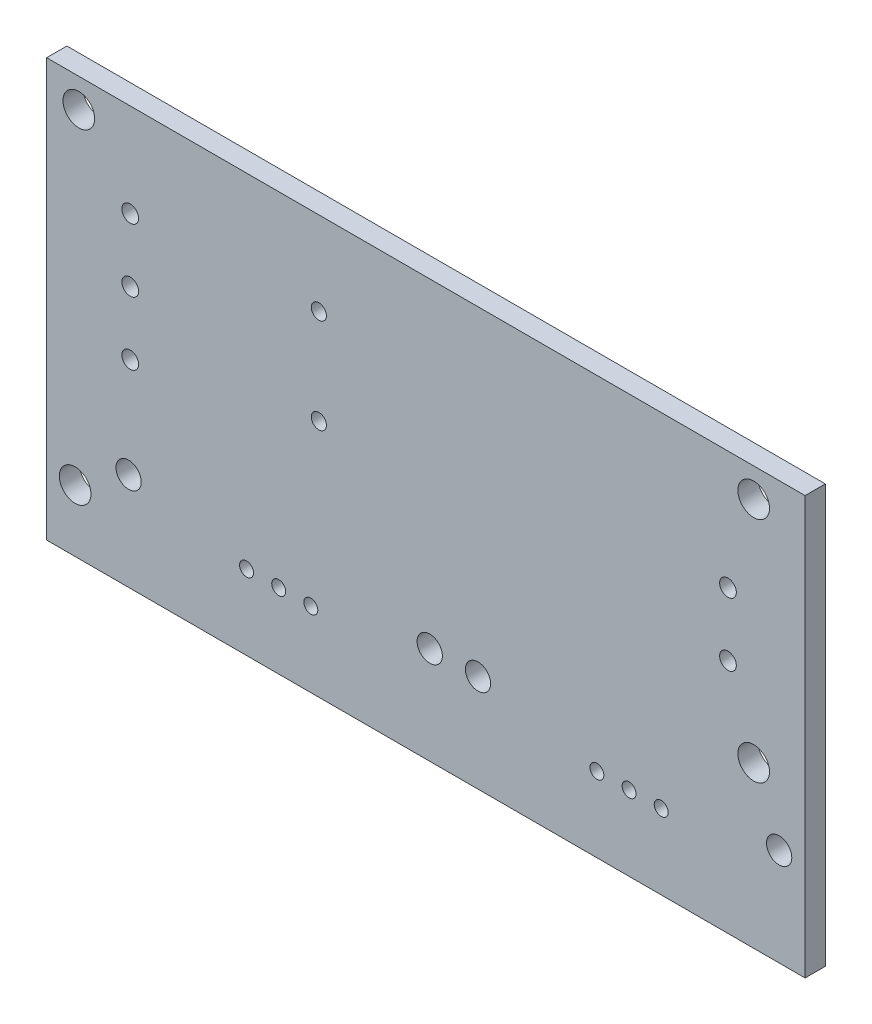
ISO-10303-21;
HEADER;
FILE_DESCRIPTION(('STEP AP214'),'2;1');
FILE_NAME('part.step','',(''),(''),'','','');
FILE_SCHEMA(('AUTOMOTIVE_DESIGN { 1 0 10303 214 1 1 1 1 }'));
ENDSEC;
DATA;
#1=APPLICATION_CONTEXT('core data for automotive mechanical design processes');
#2=APPLICATION_PROTOCOL_DEFINITION('international standard','automotive_design',2000,#1);
#3=PRODUCT_CONTEXT('',#1,'mechanical');
#4=PRODUCT('Part','Part','',(#3));
#5=PRODUCT_RELATED_PRODUCT_CATEGORY('part','',(#4));
#6=PRODUCT_DEFINITION_FORMATION('','',#4);
#7=PRODUCT_DEFINITION_CONTEXT('part definition',#1,'design');
#8=PRODUCT_DEFINITION('design','',#6,#7);
#9=PRODUCT_DEFINITION_SHAPE('','',#8);
#10=(LENGTH_UNIT() NAMED_UNIT(*) SI_UNIT(.MILLI.,.METRE.));
#11=(NAMED_UNIT(*) PLANE_ANGLE_UNIT() SI_UNIT($,.RADIAN.));
#12=(NAMED_UNIT(*) SI_UNIT($,.STERADIAN.) SOLID_ANGLE_UNIT());
#13=UNCERTAINTY_MEASURE_WITH_UNIT(LENGTH_MEASURE(1.E-05),#10,'distance_accuracy_value','');
#14=(GEOMETRIC_REPRESENTATION_CONTEXT(3) GLOBAL_UNCERTAINTY_ASSIGNED_CONTEXT((#13)) GLOBAL_UNIT_ASSIGNED_CONTEXT((#10,
#11,#12)) REPRESENTATION_CONTEXT('',''));
#15=CARTESIAN_POINT('',(0.,0.,0.));
#16=DIRECTION('',(0.,0.,1.));
#17=DIRECTION('',(1.,0.,0.));
#18=AXIS2_PLACEMENT_3D('',#15,#16,#17);
#19=CARTESIAN_POINT('',(72.644,-19.304,0.));
#20=DIRECTION('',(0.,-1.,0.));
#21=DIRECTION('',(-1.,0.,0.));
#22=AXIS2_PLACEMENT_3D('',#19,#20,#21);
#23=PLANE('',#22);
#24=DIRECTION('',(-1.,0.,0.));
#25=VECTOR('',#24,1.);
#26=CARTESIAN_POINT('',(72.644,-19.304,0.));
#27=LINE('',#26,#25);
#28=CARTESIAN_POINT('',(72.644,-19.304,0.));
#29=VERTEX_POINT('',#28);
#30=CARTESIAN_POINT('',(12.7,-19.304,0.));
#31=VERTEX_POINT('',#30);
#32=EDGE_CURVE('E10',#29,#31,#27,.T.);
#33=ORIENTED_EDGE('',*,*,#32,.T.);
#34=DIRECTION('',(0.,0.,1.));
#35=VECTOR('',#34,1.);
#36=CARTESIAN_POINT('',(12.7,-19.304,0.));
#37=LINE('',#36,#35);
#38=CARTESIAN_POINT('',(12.7,-19.304,1.6));
#39=VERTEX_POINT('',#38);
#40=EDGE_CURVE('E23',#31,#39,#37,.T.);
#41=ORIENTED_EDGE('',*,*,#40,.T.);
#42=DIRECTION('',(-1.,0.,0.));
#43=VECTOR('',#42,1.);
#44=CARTESIAN_POINT('',(72.644,-19.304,1.6));
#45=LINE('',#44,#43);
#46=CARTESIAN_POINT('',(72.644,-19.304,1.6));
#47=VERTEX_POINT('',#46);
#48=EDGE_CURVE('E299',#47,#39,#45,.T.);
#49=ORIENTED_EDGE('',*,*,#48,.F.);
#50=DIRECTION('',(0.,0.,1.));
#51=VECTOR('',#50,1.);
#52=CARTESIAN_POINT('',(72.644,-19.304,0.));
#53=LINE('',#52,#51);
#54=EDGE_CURVE('E35',#29,#47,#53,.T.);
#55=ORIENTED_EDGE('',*,*,#54,.F.);
#56=EDGE_LOOP('',(#33,#41,#49,#55));
#57=FACE_BOUND('',#56,.T.);
#58=ADVANCED_FACE('F16',(#57),#23,.F.);
#59=CARTESIAN_POINT('',(72.644,-52.324,0.));
#60=DIRECTION('',(-1.,0.,0.));
#61=DIRECTION('',(0.,1.,0.));
#62=AXIS2_PLACEMENT_3D('',#59,#60,#61);
#63=PLANE('',#62);
#64=DIRECTION('',(0.,1.,0.));
#65=VECTOR('',#64,1.);
#66=CARTESIAN_POINT('',(72.644,-52.324,0.));
#67=LINE('',#66,#65);
#68=CARTESIAN_POINT('',(72.644,-52.324,0.));
#69=VERTEX_POINT('',#68);
#70=EDGE_CURVE('E295',#69,#29,#67,.T.);
#71=ORIENTED_EDGE('',*,*,#70,.T.);
#72=ORIENTED_EDGE('',*,*,#54,.T.);
#73=DIRECTION('',(0.,1.,0.));
#74=VECTOR('',#73,1.);
#75=CARTESIAN_POINT('',(72.644,-52.324,1.6));
#76=LINE('',#75,#74);
#77=CARTESIAN_POINT('',(72.644,-52.324,1.6));
#78=VERTEX_POINT('',#77);
#79=EDGE_CURVE('E292',#78,#47,#76,.T.);
#80=ORIENTED_EDGE('',*,*,#79,.F.);
#81=DIRECTION('',(0.,0.,1.));
#82=VECTOR('',#81,1.);
#83=CARTESIAN_POINT('',(72.644,-52.324,0.));
#84=LINE('',#83,#82);
#85=EDGE_CURVE('E290',#69,#78,#84,.T.);
#86=ORIENTED_EDGE('',*,*,#85,.F.);
#87=EDGE_LOOP('',(#71,#72,#80,#86));
#88=FACE_BOUND('',#87,.T.);
#89=ADVANCED_FACE('F308',(#88),#63,.F.);
#90=CARTESIAN_POINT('',(12.7,-19.304,0.));
#91=DIRECTION('',(1.,0.,0.));
#92=DIRECTION('',(0.,-1.,0.));
#93=AXIS2_PLACEMENT_3D('',#90,#91,#92);
#94=PLANE('',#93);
#95=DIRECTION('',(0.,-1.,0.));
#96=VECTOR('',#95,1.);
#97=CARTESIAN_POINT('',(12.7,-19.304,0.));
#98=LINE('',#97,#96);
#99=CARTESIAN_POINT('',(12.7,-52.324,0.));
#100=VERTEX_POINT('',#99);
#101=EDGE_CURVE('E288',#31,#100,#98,.T.);
#102=ORIENTED_EDGE('',*,*,#101,.T.);
#103=DIRECTION('',(0.,0.,1.));
#104=VECTOR('',#103,1.);
#105=CARTESIAN_POINT('',(12.7,-52.324,0.));
#106=LINE('',#105,#104);
#107=CARTESIAN_POINT('',(12.7,-52.324,1.6));
#108=VERTEX_POINT('',#107);
#109=EDGE_CURVE('E285',#100,#108,#106,.T.);
#110=ORIENTED_EDGE('',*,*,#109,.T.);
#111=DIRECTION('',(0.,-1.,0.));
#112=VECTOR('',#111,1.);
#113=CARTESIAN_POINT('',(12.7,-19.304,1.6));
#114=LINE('',#113,#112);
#115=EDGE_CURVE('E283',#39,#108,#114,.T.);
#116=ORIENTED_EDGE('',*,*,#115,.F.);
#117=ORIENTED_EDGE('',*,*,#40,.F.);
#118=EDGE_LOOP('',(#102,#110,#116,#117));
#119=FACE_BOUND('',#118,.T.);
#120=ADVANCED_FACE('F301',(#119),#94,.F.);
#121=CARTESIAN_POINT('',(42.672,-35.814,0.));
#122=DIRECTION('',(0.,0.,1.));
#123=DIRECTION('',(1.,0.,0.));
#124=AXIS2_PLACEMENT_3D('',#121,#122,#123);
#125=PLANE('',#124);
#126=ORIENTED_EDGE('',*,*,#70,.F.);
#127=DIRECTION('',(1.,0.,0.));
#128=VECTOR('',#127,1.);
#129=CARTESIAN_POINT('',(12.7,-52.324,0.));
#130=LINE('',#129,#128);
#131=EDGE_CURVE('E280',#100,#69,#130,.T.);
#132=ORIENTED_EDGE('',*,*,#131,.F.);
#133=ORIENTED_EDGE('',*,*,#101,.F.);
#134=ORIENTED_EDGE('',*,*,#32,.F.);
#135=EDGE_LOOP('',(#126,#132,#133,#134));
#136=FACE_BOUND('',#135,.T.);
#137=CARTESIAN_POINT('',(14.95044,-47.43196,0.));
#138=DIRECTION('',(0.,0.,1.));
#139=DIRECTION('',(1.,0.,0.));
#140=AXIS2_PLACEMENT_3D('',#137,#138,#139);
#141=CIRCLE('',#140,1.25);
#142=CARTESIAN_POINT('',(16.20044,-47.43196,0.));
#143=VERTEX_POINT('',#142);
#144=EDGE_CURVE('E278',#143,#143,#141,.T.);
#145=ORIENTED_EDGE('',*,*,#144,.T.);
#146=EDGE_LOOP('',(#145));
#147=FACE_BOUND('',#146,.T.);
#148=CARTESIAN_POINT('',(19.177,-44.61256,0.));
#149=DIRECTION('',(0.,0.,1.));
#150=DIRECTION('',(1.,0.,0.));
#151=AXIS2_PLACEMENT_3D('',#148,#149,#150);
#152=CIRCLE('',#151,1.);
#153=CARTESIAN_POINT('',(20.177,-44.61256,0.));
#154=VERTEX_POINT('',#153);
#155=EDGE_CURVE('E276',#154,#154,#152,.T.);
#156=ORIENTED_EDGE('',*,*,#155,.T.);
#157=EDGE_LOOP('',(#156));
#158=FACE_BOUND('',#157,.T.);
#159=CARTESIAN_POINT('',(19.304,-31.67,0.));
#160=DIRECTION('',(0.,0.,1.));
#161=DIRECTION('',(1.,0.,0.));
#162=AXIS2_PLACEMENT_3D('',#159,#160,#161);
#163=CIRCLE('',#162,0.66);
#164=CARTESIAN_POINT('',(19.964,-31.67,0.));
#165=VERTEX_POINT('',#164);
#166=EDGE_CURVE('E274',#165,#165,#163,.T.);
#167=ORIENTED_EDGE('',*,*,#166,.T.);
#168=EDGE_LOOP('',(#167));
#169=FACE_BOUND('',#168,.T.);
#170=CARTESIAN_POINT('',(19.304,-36.67,0.));
#171=DIRECTION('',(0.,0.,1.));
#172=DIRECTION('',(1.,0.,0.));
#173=AXIS2_PLACEMENT_3D('',#170,#171,#172);
#174=CIRCLE('',#173,0.66);
#175=CARTESIAN_POINT('',(19.964,-36.67,0.));
#176=VERTEX_POINT('',#175);
#177=EDGE_CURVE('E272',#176,#176,#174,.T.);
#178=ORIENTED_EDGE('',*,*,#177,.T.);
#179=EDGE_LOOP('',(#178));
#180=FACE_BOUND('',#179,.T.);
#181=CARTESIAN_POINT('',(28.4988,-46.40326,0.));
#182=DIRECTION('',(0.,0.,1.));
#183=DIRECTION('',(1.,0.,0.));
#184=AXIS2_PLACEMENT_3D('',#181,#182,#183);
#185=CIRCLE('',#184,0.55);
#186=CARTESIAN_POINT('',(29.0488,-46.40326,0.));
#187=VERTEX_POINT('',#186);
#188=EDGE_CURVE('E270',#187,#187,#185,.T.);
#189=ORIENTED_EDGE('',*,*,#188,.T.);
#190=EDGE_LOOP('',(#189));
#191=FACE_BOUND('',#190,.T.);
#192=CARTESIAN_POINT('',(15.24,-21.59,0.));
#193=DIRECTION('',(0.,0.,1.));
#194=DIRECTION('',(1.,0.,0.));
#195=AXIS2_PLACEMENT_3D('',#192,#193,#194);
#196=CIRCLE('',#195,1.25);
#197=CARTESIAN_POINT('',(16.49,-21.59,0.));
#198=VERTEX_POINT('',#197);
#199=EDGE_CURVE('E268',#198,#198,#196,.T.);
#200=ORIENTED_EDGE('',*,*,#199,.T.);
#201=EDGE_LOOP('',(#200));
#202=FACE_BOUND('',#201,.T.);
#203=CARTESIAN_POINT('',(19.304,-26.67,0.));
#204=DIRECTION('',(0.,0.,1.));
#205=DIRECTION('',(1.,0.,0.));
#206=AXIS2_PLACEMENT_3D('',#203,#204,#205);
#207=CIRCLE('',#206,0.66);
#208=CARTESIAN_POINT('',(19.964,-26.67,0.));
#209=VERTEX_POINT('',#208);
#210=EDGE_CURVE('E266',#209,#209,#207,.T.);
#211=ORIENTED_EDGE('',*,*,#210,.T.);
#212=EDGE_LOOP('',(#211));
#213=FACE_BOUND('',#212,.T.);
#214=CARTESIAN_POINT('',(34.21126,-25.9207,0.));
#215=DIRECTION('',(0.,0.,1.));
#216=DIRECTION('',(1.,0.,0.));
#217=AXIS2_PLACEMENT_3D('',#214,#215,#216);
#218=CIRCLE('',#217,0.6);
#219=CARTESIAN_POINT('',(34.81126,-25.9207,0.));
#220=VERTEX_POINT('',#219);
#221=EDGE_CURVE('E264',#220,#220,#218,.T.);
#222=ORIENTED_EDGE('',*,*,#221,.T.);
#223=EDGE_LOOP('',(#222));
#224=FACE_BOUND('',#223,.T.);
#225=CARTESIAN_POINT('',(34.21126,-33.4207,0.));
#226=DIRECTION('',(0.,0.,1.));
#227=DIRECTION('',(1.,0.,0.));
#228=AXIS2_PLACEMENT_3D('',#225,#226,#227);
#229=CIRCLE('',#228,0.6);
#230=CARTESIAN_POINT('',(34.81126,-33.4207,0.));
#231=VERTEX_POINT('',#230);
#232=EDGE_CURVE('E262',#231,#231,#229,.T.);
#233=ORIENTED_EDGE('',*,*,#232,.T.);
#234=EDGE_LOOP('',(#233));
#235=FACE_BOUND('',#234,.T.);
#236=CARTESIAN_POINT('',(31.0388,-46.40326,0.));
#237=DIRECTION('',(0.,0.,1.));
#238=DIRECTION('',(1.,0.,0.));
#239=AXIS2_PLACEMENT_3D('',#236,#237,#238);
#240=CIRCLE('',#239,0.55);
#241=CARTESIAN_POINT('',(31.5888,-46.40326,0.));
#242=VERTEX_POINT('',#241);
#243=EDGE_CURVE('E260',#242,#242,#240,.T.);
#244=ORIENTED_EDGE('',*,*,#243,.T.);
#245=EDGE_LOOP('',(#244));
#246=FACE_BOUND('',#245,.T.);
#247=CARTESIAN_POINT('',(33.5788,-46.40326,0.));
#248=DIRECTION('',(0.,0.,1.));
#249=DIRECTION('',(1.,0.,0.));
#250=AXIS2_PLACEMENT_3D('',#247,#248,#249);
#251=CIRCLE('',#250,0.55);
#252=CARTESIAN_POINT('',(34.1288,-46.40326,0.));
#253=VERTEX_POINT('',#252);
#254=EDGE_CURVE('E258',#253,#253,#251,.T.);
#255=ORIENTED_EDGE('',*,*,#254,.T.);
#256=EDGE_LOOP('',(#255));
#257=FACE_BOUND('',#256,.T.);
#258=CARTESIAN_POINT('',(68.58,-21.59,0.));
#259=DIRECTION('',(0.,0.,1.));
#260=DIRECTION('',(1.,0.,0.));
#261=AXIS2_PLACEMENT_3D('',#258,#259,#260);
#262=CIRCLE('',#261,1.25);
#263=CARTESIAN_POINT('',(69.83,-21.59,0.));
#264=VERTEX_POINT('',#263);
#265=EDGE_CURVE('E256',#264,#264,#262,.T.);
#266=ORIENTED_EDGE('',*,*,#265,.T.);
#267=EDGE_LOOP('',(#266));
#268=FACE_BOUND('',#267,.T.);
#269=CARTESIAN_POINT('',(66.548,-33.655,0.));
#270=DIRECTION('',(0.,0.,1.));
#271=DIRECTION('',(1.,0.,0.));
#272=AXIS2_PLACEMENT_3D('',#269,#270,#271);
#273=CIRCLE('',#272,0.66);
#274=CARTESIAN_POINT('',(67.208,-33.655,0.));
#275=VERTEX_POINT('',#274);
#276=EDGE_CURVE('E254',#275,#275,#273,.T.);
#277=ORIENTED_EDGE('',*,*,#276,.T.);
#278=EDGE_LOOP('',(#277));
#279=FACE_BOUND('',#278,.T.);
#280=CARTESIAN_POINT('',(66.548,-28.655,0.));
#281=DIRECTION('',(0.,0.,1.));
#282=DIRECTION('',(1.,0.,0.));
#283=AXIS2_PLACEMENT_3D('',#280,#281,#282);
#284=CIRCLE('',#283,0.66);
#285=CARTESIAN_POINT('',(67.208,-28.655,0.));
#286=VERTEX_POINT('',#285);
#287=EDGE_CURVE('E252',#286,#286,#284,.T.);
#288=ORIENTED_EDGE('',*,*,#287,.T.);
#289=EDGE_LOOP('',(#288));
#290=FACE_BOUND('',#289,.T.);
#291=CARTESIAN_POINT('',(58.72988,-46.40326,0.));
#292=DIRECTION('',(0.,0.,1.));
#293=DIRECTION('',(1.,0.,0.));
#294=AXIS2_PLACEMENT_3D('',#291,#292,#293);
#295=CIRCLE('',#294,0.55);
#296=CARTESIAN_POINT('',(59.27988,-46.40326,0.));
#297=VERTEX_POINT('',#296);
#298=EDGE_CURVE('E250',#297,#297,#295,.T.);
#299=ORIENTED_EDGE('',*,*,#298,.T.);
#300=EDGE_LOOP('',(#299));
#301=FACE_BOUND('',#300,.T.);
#302=CARTESIAN_POINT('',(61.26988,-46.40326,0.));
#303=DIRECTION('',(0.,0.,1.));
#304=DIRECTION('',(1.,0.,0.));
#305=AXIS2_PLACEMENT_3D('',#302,#303,#304);
#306=CIRCLE('',#305,0.55);
#307=CARTESIAN_POINT('',(61.81988,-46.40326,0.));
#308=VERTEX_POINT('',#307);
#309=EDGE_CURVE('E248',#308,#308,#306,.T.);
#310=ORIENTED_EDGE('',*,*,#309,.T.);
#311=EDGE_LOOP('',(#310));
#312=FACE_BOUND('',#311,.T.);
#313=CARTESIAN_POINT('',(70.59188,-44.61256,0.));
#314=DIRECTION('',(0.,0.,1.));
#315=DIRECTION('',(1.,0.,0.));
#316=AXIS2_PLACEMENT_3D('',#313,#314,#315);
#317=CIRCLE('',#316,1.);
#318=CARTESIAN_POINT('',(71.59188,-44.61256,0.));
#319=VERTEX_POINT('',#318);
#320=EDGE_CURVE('E246',#319,#319,#317,.T.);
#321=ORIENTED_EDGE('',*,*,#320,.T.);
#322=EDGE_LOOP('',(#321));
#323=FACE_BOUND('',#322,.T.);
#324=CARTESIAN_POINT('',(68.58,-39.624,0.));
#325=DIRECTION('',(0.,0.,1.));
#326=DIRECTION('',(1.,0.,0.));
#327=AXIS2_PLACEMENT_3D('',#324,#325,#326);
#328=CIRCLE('',#327,1.25);
#329=CARTESIAN_POINT('',(69.83,-39.624,0.));
#330=VERTEX_POINT('',#329);
#331=EDGE_CURVE('E244',#330,#330,#328,.T.);
#332=ORIENTED_EDGE('',*,*,#331,.T.);
#333=EDGE_LOOP('',(#332));
#334=FACE_BOUND('',#333,.T.);
#335=CARTESIAN_POINT('',(56.18988,-46.40326,0.));
#336=DIRECTION('',(0.,0.,1.));
#337=DIRECTION('',(1.,0.,0.));
#338=AXIS2_PLACEMENT_3D('',#335,#336,#337);
#339=CIRCLE('',#338,0.55);
#340=CARTESIAN_POINT('',(56.73988,-46.40326,0.));
#341=VERTEX_POINT('',#340);
#342=EDGE_CURVE('E242',#341,#341,#339,.T.);
#343=ORIENTED_EDGE('',*,*,#342,.T.);
#344=EDGE_LOOP('',(#343));
#345=FACE_BOUND('',#344,.T.);
#346=CARTESIAN_POINT('',(46.79188,-44.61256,0.));
#347=DIRECTION('',(0.,0.,1.));
#348=DIRECTION('',(1.,0.,0.));
#349=AXIS2_PLACEMENT_3D('',#346,#347,#348);
#350=CIRCLE('',#349,1.);
#351=CARTESIAN_POINT('',(47.79188,-44.61256,0.));
#352=VERTEX_POINT('',#351);
#353=EDGE_CURVE('E240',#352,#352,#350,.T.);
#354=ORIENTED_EDGE('',*,*,#353,.T.);
#355=EDGE_LOOP('',(#354));
#356=FACE_BOUND('',#355,.T.);
#357=CARTESIAN_POINT('',(42.977,-44.61256,0.));
#358=DIRECTION('',(0.,0.,1.));
#359=DIRECTION('',(1.,0.,0.));
#360=AXIS2_PLACEMENT_3D('',#357,#358,#359);
#361=CIRCLE('',#360,1.);
#362=CARTESIAN_POINT('',(43.977,-44.61256,0.));
#363=VERTEX_POINT('',#362);
#364=EDGE_CURVE('E238',#363,#363,#361,.T.);
#365=ORIENTED_EDGE('',*,*,#364,.T.);
#366=EDGE_LOOP('',(#365));
#367=FACE_BOUND('',#366,.T.);
#368=ADVANCED_FACE('F312',(#136,#147,#158,#169,#180,#191,#202,#213,#224,#235,#246,#257,#268,
#279,#290,#301,#312,#323,#334,#345,#356,#367),#125,.F.);
#369=CARTESIAN_POINT('',(42.672,-35.814,1.6));
#370=DIRECTION('',(0.,0.,1.));
#371=DIRECTION('',(1.,0.,0.));
#372=AXIS2_PLACEMENT_3D('',#369,#370,#371);
#373=PLANE('',#372);
#374=ORIENTED_EDGE('',*,*,#48,.T.);
#375=ORIENTED_EDGE('',*,*,#115,.T.);
#376=DIRECTION('',(1.,0.,0.));
#377=VECTOR('',#376,1.);
#378=CARTESIAN_POINT('',(12.7,-52.324,1.6));
#379=LINE('',#378,#377);
#380=EDGE_CURVE('E235',#108,#78,#379,.T.);
#381=ORIENTED_EDGE('',*,*,#380,.T.);
#382=ORIENTED_EDGE('',*,*,#79,.T.);
#383=EDGE_LOOP('',(#374,#375,#381,#382));
#384=FACE_BOUND('',#383,.T.);
#385=CARTESIAN_POINT('',(33.5788,-46.40326,1.6));
#386=DIRECTION('',(0.,0.,1.));
#387=DIRECTION('',(1.,0.,0.));
#388=AXIS2_PLACEMENT_3D('',#385,#386,#387);
#389=CIRCLE('',#388,0.55);
#390=CARTESIAN_POINT('',(34.1288,-46.40326,1.6));
#391=VERTEX_POINT('',#390);
#392=EDGE_CURVE('E233',#391,#391,#389,.T.);
#393=ORIENTED_EDGE('',*,*,#392,.F.);
#394=EDGE_LOOP('',(#393));
#395=FACE_BOUND('',#394,.T.);
#396=CARTESIAN_POINT('',(46.79188,-44.61256,1.6));
#397=DIRECTION('',(0.,0.,1.));
#398=DIRECTION('',(1.,0.,0.));
#399=AXIS2_PLACEMENT_3D('',#396,#397,#398);
#400=CIRCLE('',#399,1.);
#401=CARTESIAN_POINT('',(47.79188,-44.61256,1.6));
#402=VERTEX_POINT('',#401);
#403=EDGE_CURVE('E231',#402,#402,#400,.T.);
#404=ORIENTED_EDGE('',*,*,#403,.F.);
#405=EDGE_LOOP('',(#404));
#406=FACE_BOUND('',#405,.T.);
#407=CARTESIAN_POINT('',(42.977,-44.61256,1.6));
#408=DIRECTION('',(0.,0.,1.));
#409=DIRECTION('',(1.,0.,0.));
#410=AXIS2_PLACEMENT_3D('',#407,#408,#409);
#411=CIRCLE('',#410,1.);
#412=CARTESIAN_POINT('',(43.977,-44.61256,1.6));
#413=VERTEX_POINT('',#412);
#414=EDGE_CURVE('E229',#413,#413,#411,.T.);
#415=ORIENTED_EDGE('',*,*,#414,.F.);
#416=EDGE_LOOP('',(#415));
#417=FACE_BOUND('',#416,.T.);
#418=CARTESIAN_POINT('',(34.21126,-33.4207,1.6));
#419=DIRECTION('',(0.,0.,1.));
#420=DIRECTION('',(1.,0.,0.));
#421=AXIS2_PLACEMENT_3D('',#418,#419,#420);
#422=CIRCLE('',#421,0.6);
#423=CARTESIAN_POINT('',(34.81126,-33.4207,1.6));
#424=VERTEX_POINT('',#423);
#425=EDGE_CURVE('E227',#424,#424,#422,.T.);
#426=ORIENTED_EDGE('',*,*,#425,.F.);
#427=EDGE_LOOP('',(#426));
#428=FACE_BOUND('',#427,.T.);
#429=CARTESIAN_POINT('',(66.548,-28.655,1.6));
#430=DIRECTION('',(0.,0.,1.));
#431=DIRECTION('',(1.,0.,0.));
#432=AXIS2_PLACEMENT_3D('',#429,#430,#431);
#433=CIRCLE('',#432,0.66);
#434=CARTESIAN_POINT('',(67.208,-28.655,1.6));
#435=VERTEX_POINT('',#434);
#436=EDGE_CURVE('E225',#435,#435,#433,.T.);
#437=ORIENTED_EDGE('',*,*,#436,.F.);
#438=EDGE_LOOP('',(#437));
#439=FACE_BOUND('',#438,.T.);
#440=CARTESIAN_POINT('',(66.548,-33.655,1.6));
#441=DIRECTION('',(0.,0.,1.));
#442=DIRECTION('',(1.,0.,0.));
#443=AXIS2_PLACEMENT_3D('',#440,#441,#442);
#444=CIRCLE('',#443,0.66);
#445=CARTESIAN_POINT('',(67.208,-33.655,1.6));
#446=VERTEX_POINT('',#445);
#447=EDGE_CURVE('E223',#446,#446,#444,.T.);
#448=ORIENTED_EDGE('',*,*,#447,.F.);
#449=EDGE_LOOP('',(#448));
#450=FACE_BOUND('',#449,.T.);
#451=CARTESIAN_POINT('',(61.26988,-46.40326,1.6));
#452=DIRECTION('',(0.,0.,1.));
#453=DIRECTION('',(1.,0.,0.));
#454=AXIS2_PLACEMENT_3D('',#451,#452,#453);
#455=CIRCLE('',#454,0.55);
#456=CARTESIAN_POINT('',(61.81988,-46.40326,1.6));
#457=VERTEX_POINT('',#456);
#458=EDGE_CURVE('E221',#457,#457,#455,.T.);
#459=ORIENTED_EDGE('',*,*,#458,.F.);
#460=EDGE_LOOP('',(#459));
#461=FACE_BOUND('',#460,.T.);
#462=CARTESIAN_POINT('',(58.72988,-46.40326,1.6));
#463=DIRECTION('',(0.,0.,1.));
#464=DIRECTION('',(1.,0.,0.));
#465=AXIS2_PLACEMENT_3D('',#462,#463,#464);
#466=CIRCLE('',#465,0.55);
#467=CARTESIAN_POINT('',(59.27988,-46.40326,1.6));
#468=VERTEX_POINT('',#467);
#469=EDGE_CURVE('E219',#468,#468,#466,.T.);
#470=ORIENTED_EDGE('',*,*,#469,.F.);
#471=EDGE_LOOP('',(#470));
#472=FACE_BOUND('',#471,.T.);
#473=CARTESIAN_POINT('',(56.18988,-46.40326,1.6));
#474=DIRECTION('',(0.,0.,1.));
#475=DIRECTION('',(1.,0.,0.));
#476=AXIS2_PLACEMENT_3D('',#473,#474,#475);
#477=CIRCLE('',#476,0.55);
#478=CARTESIAN_POINT('',(56.73988,-46.40326,1.6));
#479=VERTEX_POINT('',#478);
#480=EDGE_CURVE('E217',#479,#479,#477,.T.);
#481=ORIENTED_EDGE('',*,*,#480,.F.);
#482=EDGE_LOOP('',(#481));
#483=FACE_BOUND('',#482,.T.);
#484=CARTESIAN_POINT('',(19.304,-26.67,1.6));
#485=DIRECTION('',(0.,0.,1.));
#486=DIRECTION('',(1.,0.,0.));
#487=AXIS2_PLACEMENT_3D('',#484,#485,#486);
#488=CIRCLE('',#487,0.66);
#489=CARTESIAN_POINT('',(19.964,-26.67,1.6));
#490=VERTEX_POINT('',#489);
#491=EDGE_CURVE('E215',#490,#490,#488,.T.);
#492=ORIENTED_EDGE('',*,*,#491,.F.);
#493=EDGE_LOOP('',(#492));
#494=FACE_BOUND('',#493,.T.);
#495=CARTESIAN_POINT('',(19.304,-31.67,1.6));
#496=DIRECTION('',(0.,0.,1.));
#497=DIRECTION('',(1.,0.,0.));
#498=AXIS2_PLACEMENT_3D('',#495,#496,#497);
#499=CIRCLE('',#498,0.66);
#500=CARTESIAN_POINT('',(19.964,-31.67,1.6));
#501=VERTEX_POINT('',#500);
#502=EDGE_CURVE('E213',#501,#501,#499,.T.);
#503=ORIENTED_EDGE('',*,*,#502,.F.);
#504=EDGE_LOOP('',(#503));
#505=FACE_BOUND('',#504,.T.);
#506=CARTESIAN_POINT('',(19.304,-36.67,1.6));
#507=DIRECTION('',(0.,0.,1.));
#508=DIRECTION('',(1.,0.,0.));
#509=AXIS2_PLACEMENT_3D('',#506,#507,#508);
#510=CIRCLE('',#509,0.66);
#511=CARTESIAN_POINT('',(19.964,-36.67,1.6));
#512=VERTEX_POINT('',#511);
#513=EDGE_CURVE('E211',#512,#512,#510,.T.);
#514=ORIENTED_EDGE('',*,*,#513,.F.);
#515=EDGE_LOOP('',(#514));
#516=FACE_BOUND('',#515,.T.);
#517=CARTESIAN_POINT('',(28.4988,-46.40326,1.6));
#518=DIRECTION('',(0.,0.,1.));
#519=DIRECTION('',(1.,0.,0.));
#520=AXIS2_PLACEMENT_3D('',#517,#518,#519);
#521=CIRCLE('',#520,0.55);
#522=CARTESIAN_POINT('',(29.0488,-46.40326,1.6));
#523=VERTEX_POINT('',#522);
#524=EDGE_CURVE('E209',#523,#523,#521,.T.);
#525=ORIENTED_EDGE('',*,*,#524,.F.);
#526=EDGE_LOOP('',(#525));
#527=FACE_BOUND('',#526,.T.);
#528=CARTESIAN_POINT('',(19.177,-44.61256,1.6));
#529=DIRECTION('',(0.,0.,1.));
#530=DIRECTION('',(1.,0.,0.));
#531=AXIS2_PLACEMENT_3D('',#528,#529,#530);
#532=CIRCLE('',#531,1.);
#533=CARTESIAN_POINT('',(20.177,-44.61256,1.6));
#534=VERTEX_POINT('',#533);
#535=EDGE_CURVE('E207',#534,#534,#532,.T.);
#536=ORIENTED_EDGE('',*,*,#535,.F.);
#537=EDGE_LOOP('',(#536));
#538=FACE_BOUND('',#537,.T.);
#539=CARTESIAN_POINT('',(34.21126,-25.9207,1.6));
#540=DIRECTION('',(0.,0.,1.));
#541=DIRECTION('',(1.,0.,0.));
#542=AXIS2_PLACEMENT_3D('',#539,#540,#541);
#543=CIRCLE('',#542,0.6);
#544=CARTESIAN_POINT('',(34.81126,-25.9207,1.6));
#545=VERTEX_POINT('',#544);
#546=EDGE_CURVE('E205',#545,#545,#543,.T.);
#547=ORIENTED_EDGE('',*,*,#546,.F.);
#548=EDGE_LOOP('',(#547));
#549=FACE_BOUND('',#548,.T.);
#550=CARTESIAN_POINT('',(31.0388,-46.40326,1.6));
#551=DIRECTION('',(0.,0.,1.));
#552=DIRECTION('',(1.,0.,0.));
#553=AXIS2_PLACEMENT_3D('',#550,#551,#552);
#554=CIRCLE('',#553,0.55);
#555=CARTESIAN_POINT('',(31.5888,-46.40326,1.6));
#556=VERTEX_POINT('',#555);
#557=EDGE_CURVE('E203',#556,#556,#554,.T.);
#558=ORIENTED_EDGE('',*,*,#557,.F.);
#559=EDGE_LOOP('',(#558));
#560=FACE_BOUND('',#559,.T.);
#561=CARTESIAN_POINT('',(68.58,-39.624,1.6));
#562=DIRECTION('',(0.,0.,1.));
#563=DIRECTION('',(1.,0.,0.));
#564=AXIS2_PLACEMENT_3D('',#561,#562,#563);
#565=CIRCLE('',#564,1.25);
#566=CARTESIAN_POINT('',(69.83,-39.624,1.6));
#567=VERTEX_POINT('',#566);
#568=EDGE_CURVE('E201',#567,#567,#565,.T.);
#569=ORIENTED_EDGE('',*,*,#568,.F.);
#570=EDGE_LOOP('',(#569));
#571=FACE_BOUND('',#570,.T.);
#572=CARTESIAN_POINT('',(70.59188,-44.61256,1.6));
#573=DIRECTION('',(0.,0.,1.));
#574=DIRECTION('',(1.,0.,0.));
#575=AXIS2_PLACEMENT_3D('',#572,#573,#574);
#576=CIRCLE('',#575,1.);
#577=CARTESIAN_POINT('',(71.59188,-44.61256,1.6));
#578=VERTEX_POINT('',#577);
#579=EDGE_CURVE('E199',#578,#578,#576,.T.);
#580=ORIENTED_EDGE('',*,*,#579,.F.);
#581=EDGE_LOOP('',(#580));
#582=FACE_BOUND('',#581,.T.);
#583=CARTESIAN_POINT('',(14.95044,-47.43196,1.6));
#584=DIRECTION('',(0.,0.,1.));
#585=DIRECTION('',(1.,0.,0.));
#586=AXIS2_PLACEMENT_3D('',#583,#584,#585);
#587=CIRCLE('',#586,1.25);
#588=CARTESIAN_POINT('',(16.20044,-47.43196,1.6));
#589=VERTEX_POINT('',#588);
#590=EDGE_CURVE('E191',#589,#589,#587,.T.);
#591=ORIENTED_EDGE('',*,*,#590,.F.);
#592=EDGE_LOOP('',(#591));
#593=FACE_BOUND('',#592,.T.);
#594=CARTESIAN_POINT('',(15.24,-21.59,1.6));
#595=DIRECTION('',(0.,0.,1.));
#596=DIRECTION('',(1.,0.,0.));
#597=AXIS2_PLACEMENT_3D('',#594,#595,#596);
#598=CIRCLE('',#597,1.25);
#599=CARTESIAN_POINT('',(16.49,-21.59,1.6));
#600=VERTEX_POINT('',#599);
#601=EDGE_CURVE('E188',#600,#600,#598,.T.);
#602=ORIENTED_EDGE('',*,*,#601,.F.);
#603=EDGE_LOOP('',(#602));
#604=FACE_BOUND('',#603,.T.);
#605=CARTESIAN_POINT('',(68.58,-21.59,1.6));
#606=DIRECTION('',(0.,0.,1.));
#607=DIRECTION('',(1.,0.,0.));
#608=AXIS2_PLACEMENT_3D('',#605,#606,#607);
#609=CIRCLE('',#608,1.25);
#610=CARTESIAN_POINT('',(69.83,-21.59,1.6));
#611=VERTEX_POINT('',#610);
#612=EDGE_CURVE('E183',#611,#611,#609,.T.);
#613=ORIENTED_EDGE('',*,*,#612,.F.);
#614=EDGE_LOOP('',(#613));
#615=FACE_BOUND('',#614,.T.);
#616=ADVANCED_FACE('F304',(#384,#395,#406,#417,#428,#439,#450,#461,#472,#483,#494,#505,#516,
#527,#538,#549,#560,#571,#582,#593,#604,#615),#373,.T.);
#617=CARTESIAN_POINT('',(12.7,-52.324,0.));
#618=DIRECTION('',(0.,1.,0.));
#619=DIRECTION('',(1.,0.,0.));
#620=AXIS2_PLACEMENT_3D('',#617,#618,#619);
#621=PLANE('',#620);
#622=ORIENTED_EDGE('',*,*,#131,.T.);
#623=ORIENTED_EDGE('',*,*,#85,.T.);
#624=ORIENTED_EDGE('',*,*,#380,.F.);
#625=ORIENTED_EDGE('',*,*,#109,.F.);
#626=EDGE_LOOP('',(#622,#623,#624,#625));
#627=FACE_BOUND('',#626,.T.);
#628=ADVANCED_FACE('F315',(#627),#621,.F.);
#629=CARTESIAN_POINT('',(14.95044,-47.43196,-0.8));
#630=DIRECTION('',(0.,0.,1.));
#631=DIRECTION('',(1.,0.,0.));
#632=AXIS2_PLACEMENT_3D('',#629,#630,#631);
#633=CYLINDRICAL_SURFACE('',#632,1.25);
#634=DIRECTION('',(0.,0.,1.));
#635=VECTOR('',#634,1.);
#636=CARTESIAN_POINT('',(16.20044,-47.43196,-0.8));
#637=LINE('',#636,#635);
#638=EDGE_CURVE('E189',#143,#589,#637,.T.);
#639=ORIENTED_EDGE('',*,*,#638,.F.);
#640=ORIENTED_EDGE('',*,*,#144,.F.);
#641=ORIENTED_EDGE('',*,*,#638,.T.);
#642=ORIENTED_EDGE('',*,*,#590,.T.);
#643=EDGE_LOOP('',(#639,#640,#641,#642));
#644=FACE_BOUND('',#643,.T.);
#645=ADVANCED_FACE('F317',(#644),#633,.F.);
#646=CARTESIAN_POINT('',(19.177,-44.61256,-0.8));
#647=DIRECTION('',(0.,0.,1.));
#648=DIRECTION('',(1.,0.,0.));
#649=AXIS2_PLACEMENT_3D('',#646,#647,#648);
#650=CYLINDRICAL_SURFACE('',#649,1.);
#651=DIRECTION('',(0.,0.,1.));
#652=VECTOR('',#651,1.);
#653=CARTESIAN_POINT('',(20.177,-44.61256,-0.8));
#654=LINE('',#653,#652);
#655=EDGE_CURVE('E194',#154,#534,#654,.T.);
#656=ORIENTED_EDGE('',*,*,#655,.F.);
#657=ORIENTED_EDGE('',*,*,#155,.F.);
#658=ORIENTED_EDGE('',*,*,#655,.T.);
#659=ORIENTED_EDGE('',*,*,#535,.T.);
#660=EDGE_LOOP('',(#656,#657,#658,#659));
#661=FACE_BOUND('',#660,.T.);
#662=ADVANCED_FACE('F324',(#661),#650,.F.);
#663=CARTESIAN_POINT('',(19.304,-31.67,-0.8));
#664=DIRECTION('',(0.,0.,1.));
#665=DIRECTION('',(1.,0.,0.));
#666=AXIS2_PLACEMENT_3D('',#663,#664,#665);
#667=CYLINDRICAL_SURFACE('',#666,0.66);
#668=DIRECTION('',(0.,0.,1.));
#669=VECTOR('',#668,1.);
#670=CARTESIAN_POINT('',(19.964,-31.67,-0.8));
#671=LINE('',#670,#669);
#672=EDGE_CURVE('E622',#165,#501,#671,.T.);
#673=ORIENTED_EDGE('',*,*,#672,.F.);
#674=ORIENTED_EDGE('',*,*,#166,.F.);
#675=ORIENTED_EDGE('',*,*,#672,.T.);
#676=ORIENTED_EDGE('',*,*,#502,.T.);
#677=EDGE_LOOP('',(#673,#674,#675,#676));
#678=FACE_BOUND('',#677,.T.);
#679=ADVANCED_FACE('F372',(#678),#667,.F.);
#680=CARTESIAN_POINT('',(19.304,-36.67,-0.8));
#681=DIRECTION('',(0.,0.,1.));
#682=DIRECTION('',(1.,0.,0.));
#683=AXIS2_PLACEMENT_3D('',#680,#681,#682);
#684=CYLINDRICAL_SURFACE('',#683,0.66);
#685=DIRECTION('',(0.,0.,1.));
#686=VECTOR('',#685,1.);
#687=CARTESIAN_POINT('',(19.964,-36.67,-0.8));
#688=LINE('',#687,#686);
#689=EDGE_CURVE('E619',#176,#512,#688,.T.);
#690=ORIENTED_EDGE('',*,*,#689,.F.);
#691=ORIENTED_EDGE('',*,*,#177,.F.);
#692=ORIENTED_EDGE('',*,*,#689,.T.);
#693=ORIENTED_EDGE('',*,*,#513,.T.);
#694=EDGE_LOOP('',(#690,#691,#692,#693));
#695=FACE_BOUND('',#694,.T.);
#696=ADVANCED_FACE('F382',(#695),#684,.F.);
#697=CARTESIAN_POINT('',(28.4988,-46.40326,-0.8));
#698=DIRECTION('',(0.,0.,1.));
#699=DIRECTION('',(1.,0.,0.));
#700=AXIS2_PLACEMENT_3D('',#697,#698,#699);
#701=CYLINDRICAL_SURFACE('',#700,0.55);
#702=DIRECTION('',(0.,0.,1.));
#703=VECTOR('',#702,1.);
#704=CARTESIAN_POINT('',(29.0488,-46.40326,-0.8));
#705=LINE('',#704,#703);
#706=EDGE_CURVE('E616',#187,#523,#705,.T.);
#707=ORIENTED_EDGE('',*,*,#706,.F.);
#708=ORIENTED_EDGE('',*,*,#188,.F.);
#709=ORIENTED_EDGE('',*,*,#706,.T.);
#710=ORIENTED_EDGE('',*,*,#524,.T.);
#711=EDGE_LOOP('',(#707,#708,#709,#710));
#712=FACE_BOUND('',#711,.T.);
#713=ADVANCED_FACE('F392',(#712),#701,.F.);
#714=CARTESIAN_POINT('',(15.24,-21.59,-0.8));
#715=DIRECTION('',(0.,0.,1.));
#716=DIRECTION('',(1.,0.,0.));
#717=AXIS2_PLACEMENT_3D('',#714,#715,#716);
#718=CYLINDRICAL_SURFACE('',#717,1.25);
#719=DIRECTION('',(0.,0.,1.));
#720=VECTOR('',#719,1.);
#721=CARTESIAN_POINT('',(16.49,-21.59,-0.8));
#722=LINE('',#721,#720);
#723=EDGE_CURVE('E613',#198,#600,#722,.T.);
#724=ORIENTED_EDGE('',*,*,#723,.F.);
#725=ORIENTED_EDGE('',*,*,#199,.F.);
#726=ORIENTED_EDGE('',*,*,#723,.T.);
#727=ORIENTED_EDGE('',*,*,#601,.T.);
#728=EDGE_LOOP('',(#724,#725,#726,#727));
#729=FACE_BOUND('',#728,.T.);
#730=ADVANCED_FACE('F402',(#729),#718,.F.);
#731=CARTESIAN_POINT('',(19.304,-26.67,-0.8));
#732=DIRECTION('',(0.,0.,1.));
#733=DIRECTION('',(1.,0.,0.));
#734=AXIS2_PLACEMENT_3D('',#731,#732,#733);
#735=CYLINDRICAL_SURFACE('',#734,0.66);
#736=DIRECTION('',(0.,0.,1.));
#737=VECTOR('',#736,1.);
#738=CARTESIAN_POINT('',(19.964,-26.67,-0.8));
#739=LINE('',#738,#737);
#740=EDGE_CURVE('E610',#209,#490,#739,.T.);
#741=ORIENTED_EDGE('',*,*,#740,.F.);
#742=ORIENTED_EDGE('',*,*,#210,.F.);
#743=ORIENTED_EDGE('',*,*,#740,.T.);
#744=ORIENTED_EDGE('',*,*,#491,.T.);
#745=EDGE_LOOP('',(#741,#742,#743,#744));
#746=FACE_BOUND('',#745,.T.);
#747=ADVANCED_FACE('F412',(#746),#735,.F.);
#748=CARTESIAN_POINT('',(34.21126,-25.9207,-0.8));
#749=DIRECTION('',(0.,0.,1.));
#750=DIRECTION('',(1.,0.,0.));
#751=AXIS2_PLACEMENT_3D('',#748,#749,#750);
#752=CYLINDRICAL_SURFACE('',#751,0.6);
#753=DIRECTION('',(0.,0.,1.));
#754=VECTOR('',#753,1.);
#755=CARTESIAN_POINT('',(34.81126,-25.9207,-0.8));
#756=LINE('',#755,#754);
#757=EDGE_CURVE('E607',#220,#545,#756,.T.);
#758=ORIENTED_EDGE('',*,*,#757,.F.);
#759=ORIENTED_EDGE('',*,*,#221,.F.);
#760=ORIENTED_EDGE('',*,*,#757,.T.);
#761=ORIENTED_EDGE('',*,*,#546,.T.);
#762=EDGE_LOOP('',(#758,#759,#760,#761));
#763=FACE_BOUND('',#762,.T.);
#764=ADVANCED_FACE('F422',(#763),#752,.F.);
#765=CARTESIAN_POINT('',(34.21126,-33.4207,-0.8));
#766=DIRECTION('',(0.,0.,1.));
#767=DIRECTION('',(1.,0.,0.));
#768=AXIS2_PLACEMENT_3D('',#765,#766,#767);
#769=CYLINDRICAL_SURFACE('',#768,0.6);
#770=DIRECTION('',(0.,0.,1.));
#771=VECTOR('',#770,1.);
#772=CARTESIAN_POINT('',(34.81126,-33.4207,-0.8));
#773=LINE('',#772,#771);
#774=EDGE_CURVE('E604',#231,#424,#773,.T.);
#775=ORIENTED_EDGE('',*,*,#774,.F.);
#776=ORIENTED_EDGE('',*,*,#232,.F.);
#777=ORIENTED_EDGE('',*,*,#774,.T.);
#778=ORIENTED_EDGE('',*,*,#425,.T.);
#779=EDGE_LOOP('',(#775,#776,#777,#778));
#780=FACE_BOUND('',#779,.T.);
#781=ADVANCED_FACE('F432',(#780),#769,.F.);
#782=CARTESIAN_POINT('',(31.0388,-46.40326,-0.8));
#783=DIRECTION('',(0.,0.,1.));
#784=DIRECTION('',(1.,0.,0.));
#785=AXIS2_PLACEMENT_3D('',#782,#783,#784);
#786=CYLINDRICAL_SURFACE('',#785,0.55);
#787=DIRECTION('',(0.,0.,1.));
#788=VECTOR('',#787,1.);
#789=CARTESIAN_POINT('',(31.5888,-46.40326,-0.8));
#790=LINE('',#789,#788);
#791=EDGE_CURVE('E601',#242,#556,#790,.T.);
#792=ORIENTED_EDGE('',*,*,#791,.F.);
#793=ORIENTED_EDGE('',*,*,#243,.F.);
#794=ORIENTED_EDGE('',*,*,#791,.T.);
#795=ORIENTED_EDGE('',*,*,#557,.T.);
#796=EDGE_LOOP('',(#792,#793,#794,#795));
#797=FACE_BOUND('',#796,.T.);
#798=ADVANCED_FACE('F442',(#797),#786,.F.);
#799=CARTESIAN_POINT('',(33.5788,-46.40326,-0.8));
#800=DIRECTION('',(0.,0.,1.));
#801=DIRECTION('',(1.,0.,0.));
#802=AXIS2_PLACEMENT_3D('',#799,#800,#801);
#803=CYLINDRICAL_SURFACE('',#802,0.55);
#804=DIRECTION('',(0.,0.,1.));
#805=VECTOR('',#804,1.);
#806=CARTESIAN_POINT('',(34.1288,-46.40326,-0.8));
#807=LINE('',#806,#805);
#808=EDGE_CURVE('E598',#253,#391,#807,.T.);
#809=ORIENTED_EDGE('',*,*,#808,.F.);
#810=ORIENTED_EDGE('',*,*,#254,.F.);
#811=ORIENTED_EDGE('',*,*,#808,.T.);
#812=ORIENTED_EDGE('',*,*,#392,.T.);
#813=EDGE_LOOP('',(#809,#810,#811,#812));
#814=FACE_BOUND('',#813,.T.);
#815=ADVANCED_FACE('F452',(#814),#803,.F.);
#816=CARTESIAN_POINT('',(68.58,-21.59,-0.8));
#817=DIRECTION('',(0.,0.,1.));
#818=DIRECTION('',(1.,0.,0.));
#819=AXIS2_PLACEMENT_3D('',#816,#817,#818);
#820=CYLINDRICAL_SURFACE('',#819,1.25);
#821=DIRECTION('',(0.,0.,1.));
#822=VECTOR('',#821,1.);
#823=CARTESIAN_POINT('',(69.83,-21.59,-0.8));
#824=LINE('',#823,#822);
#825=EDGE_CURVE('E186',#264,#611,#824,.T.);
#826=ORIENTED_EDGE('',*,*,#825,.F.);
#827=ORIENTED_EDGE('',*,*,#265,.F.);
#828=ORIENTED_EDGE('',*,*,#825,.T.);
#829=ORIENTED_EDGE('',*,*,#612,.T.);
#830=EDGE_LOOP('',(#826,#827,#828,#829));
#831=FACE_BOUND('',#830,.T.);
#832=ADVANCED_FACE('F184',(#831),#820,.F.);
#833=CARTESIAN_POINT('',(66.548,-33.655,-0.8));
#834=DIRECTION('',(0.,0.,1.));
#835=DIRECTION('',(1.,0.,0.));
#836=AXIS2_PLACEMENT_3D('',#833,#834,#835);
#837=CYLINDRICAL_SURFACE('',#836,0.66);
#838=DIRECTION('',(0.,0.,1.));
#839=VECTOR('',#838,1.);
#840=CARTESIAN_POINT('',(67.208,-33.655,-0.8));
#841=LINE('',#840,#839);
#842=EDGE_CURVE('E594',#275,#446,#841,.T.);
#843=ORIENTED_EDGE('',*,*,#842,.F.);
#844=ORIENTED_EDGE('',*,*,#276,.F.);
#845=ORIENTED_EDGE('',*,*,#842,.T.);
#846=ORIENTED_EDGE('',*,*,#447,.T.);
#847=EDGE_LOOP('',(#843,#844,#845,#846));
#848=FACE_BOUND('',#847,.T.);
#849=ADVANCED_FACE('F471',(#848),#837,.F.);
#850=CARTESIAN_POINT('',(66.548,-28.655,-0.8));
#851=DIRECTION('',(0.,0.,1.));
#852=DIRECTION('',(1.,0.,0.));
#853=AXIS2_PLACEMENT_3D('',#850,#851,#852);
#854=CYLINDRICAL_SURFACE('',#853,0.66);
#855=DIRECTION('',(0.,0.,1.));
#856=VECTOR('',#855,1.);
#857=CARTESIAN_POINT('',(67.208,-28.655,-0.8));
#858=LINE('',#857,#856);
#859=EDGE_CURVE('E591',#286,#435,#858,.T.);
#860=ORIENTED_EDGE('',*,*,#859,.F.);
#861=ORIENTED_EDGE('',*,*,#287,.F.);
#862=ORIENTED_EDGE('',*,*,#859,.T.);
#863=ORIENTED_EDGE('',*,*,#436,.T.);
#864=EDGE_LOOP('',(#860,#861,#862,#863));
#865=FACE_BOUND('',#864,.T.);
#866=ADVANCED_FACE('F480',(#865),#854,.F.);
#867=CARTESIAN_POINT('',(58.72988,-46.40326,-0.8));
#868=DIRECTION('',(0.,0.,1.));
#869=DIRECTION('',(1.,0.,0.));
#870=AXIS2_PLACEMENT_3D('',#867,#868,#869);
#871=CYLINDRICAL_SURFACE('',#870,0.55);
#872=DIRECTION('',(0.,0.,1.));
#873=VECTOR('',#872,1.);
#874=CARTESIAN_POINT('',(59.27988,-46.40326,-0.8));
#875=LINE('',#874,#873);
#876=EDGE_CURVE('E588',#297,#468,#875,.T.);
#877=ORIENTED_EDGE('',*,*,#876,.F.);
#878=ORIENTED_EDGE('',*,*,#298,.F.);
#879=ORIENTED_EDGE('',*,*,#876,.T.);
#880=ORIENTED_EDGE('',*,*,#469,.T.);
#881=EDGE_LOOP('',(#877,#878,#879,#880));
#882=FACE_BOUND('',#881,.T.);
#883=ADVANCED_FACE('F490',(#882),#871,.F.);
#884=CARTESIAN_POINT('',(61.26988,-46.40326,-0.8));
#885=DIRECTION('',(0.,0.,1.));
#886=DIRECTION('',(1.,0.,0.));
#887=AXIS2_PLACEMENT_3D('',#884,#885,#886);
#888=CYLINDRICAL_SURFACE('',#887,0.55);
#889=DIRECTION('',(0.,0.,1.));
#890=VECTOR('',#889,1.);
#891=CARTESIAN_POINT('',(61.81988,-46.40326,-0.8));
#892=LINE('',#891,#890);
#893=EDGE_CURVE('E585',#308,#457,#892,.T.);
#894=ORIENTED_EDGE('',*,*,#893,.F.);
#895=ORIENTED_EDGE('',*,*,#309,.F.);
#896=ORIENTED_EDGE('',*,*,#893,.T.);
#897=ORIENTED_EDGE('',*,*,#458,.T.);
#898=EDGE_LOOP('',(#894,#895,#896,#897));
#899=FACE_BOUND('',#898,.T.);
#900=ADVANCED_FACE('F500',(#899),#888,.F.);
#901=CARTESIAN_POINT('',(70.59188,-44.61256,-0.8));
#902=DIRECTION('',(0.,0.,1.));
#903=DIRECTION('',(1.,0.,0.));
#904=AXIS2_PLACEMENT_3D('',#901,#902,#903);
#905=CYLINDRICAL_SURFACE('',#904,1.);
#906=DIRECTION('',(0.,0.,1.));
#907=VECTOR('',#906,1.);
#908=CARTESIAN_POINT('',(71.59188,-44.61256,-0.8));
#909=LINE('',#908,#907);
#910=EDGE_CURVE('E582',#319,#578,#909,.T.);
#911=ORIENTED_EDGE('',*,*,#910,.F.);
#912=ORIENTED_EDGE('',*,*,#320,.F.);
#913=ORIENTED_EDGE('',*,*,#910,.T.);
#914=ORIENTED_EDGE('',*,*,#579,.T.);
#915=EDGE_LOOP('',(#911,#912,#913,#914));
#916=FACE_BOUND('',#915,.T.);
#917=ADVANCED_FACE('F510',(#916),#905,.F.);
#918=CARTESIAN_POINT('',(68.58,-39.624,-0.8));
#919=DIRECTION('',(0.,0.,1.));
#920=DIRECTION('',(1.,0.,0.));
#921=AXIS2_PLACEMENT_3D('',#918,#919,#920);
#922=CYLINDRICAL_SURFACE('',#921,1.25);
#923=DIRECTION('',(0.,0.,1.));
#924=VECTOR('',#923,1.);
#925=CARTESIAN_POINT('',(69.83,-39.624,-0.8));
#926=LINE('',#925,#924);
#927=EDGE_CURVE('E579',#330,#567,#926,.T.);
#928=ORIENTED_EDGE('',*,*,#927,.F.);
#929=ORIENTED_EDGE('',*,*,#331,.F.);
#930=ORIENTED_EDGE('',*,*,#927,.T.);
#931=ORIENTED_EDGE('',*,*,#568,.T.);
#932=EDGE_LOOP('',(#928,#929,#930,#931));
#933=FACE_BOUND('',#932,.T.);
#934=ADVANCED_FACE('F520',(#933),#922,.F.);
#935=CARTESIAN_POINT('',(56.18988,-46.40326,-0.8));
#936=DIRECTION('',(0.,0.,1.));
#937=DIRECTION('',(1.,0.,0.));
#938=AXIS2_PLACEMENT_3D('',#935,#936,#937);
#939=CYLINDRICAL_SURFACE('',#938,0.55);
#940=DIRECTION('',(0.,0.,1.));
#941=VECTOR('',#940,1.);
#942=CARTESIAN_POINT('',(56.73988,-46.40326,-0.8));
#943=LINE('',#942,#941);
#944=EDGE_CURVE('E574',#341,#479,#943,.T.);
#945=ORIENTED_EDGE('',*,*,#944,.F.);
#946=ORIENTED_EDGE('',*,*,#342,.F.);
#947=ORIENTED_EDGE('',*,*,#944,.T.);
#948=ORIENTED_EDGE('',*,*,#480,.T.);
#949=EDGE_LOOP('',(#945,#946,#947,#948));
#950=FACE_BOUND('',#949,.T.);
#951=ADVANCED_FACE('F530',(#950),#939,.F.);
#952=CARTESIAN_POINT('',(46.79188,-44.61256,-0.8));
#953=DIRECTION('',(0.,0.,1.));
#954=DIRECTION('',(1.,0.,0.));
#955=AXIS2_PLACEMENT_3D('',#952,#953,#954);
#956=CYLINDRICAL_SURFACE('',#955,1.);
#957=DIRECTION('',(0.,0.,1.));
#958=VECTOR('',#957,1.);
#959=CARTESIAN_POINT('',(47.79188,-44.61256,-0.8));
#960=LINE('',#959,#958);
#961=EDGE_CURVE('E571',#352,#402,#960,.T.);
#962=ORIENTED_EDGE('',*,*,#961,.F.);
#963=ORIENTED_EDGE('',*,*,#353,.F.);
#964=ORIENTED_EDGE('',*,*,#961,.T.);
#965=ORIENTED_EDGE('',*,*,#403,.T.);
#966=EDGE_LOOP('',(#962,#963,#964,#965));
#967=FACE_BOUND('',#966,.T.);
#968=ADVANCED_FACE('F540',(#967),#956,.F.);
#969=CARTESIAN_POINT('',(42.977,-44.61256,-0.8));
#970=DIRECTION('',(0.,0.,1.));
#971=DIRECTION('',(1.,0.,0.));
#972=AXIS2_PLACEMENT_3D('',#969,#970,#971);
#973=CYLINDRICAL_SURFACE('',#972,1.);
#974=DIRECTION('',(0.,0.,1.));
#975=VECTOR('',#974,1.);
#976=CARTESIAN_POINT('',(43.977,-44.61256,-0.8));
#977=LINE('',#976,#975);
#978=EDGE_CURVE('E569',#363,#413,#977,.T.);
#979=ORIENTED_EDGE('',*,*,#978,.F.);
#980=ORIENTED_EDGE('',*,*,#364,.F.);
#981=ORIENTED_EDGE('',*,*,#978,.T.);
#982=ORIENTED_EDGE('',*,*,#414,.T.);
#983=EDGE_LOOP('',(#979,#980,#981,#982));
#984=FACE_BOUND('',#983,.T.);
#985=ADVANCED_FACE('F550',(#984),#973,.F.);
#986=CLOSED_SHELL('',(#58,#89,#120,#368,#616,#628,#645,#662,#679,#696,#713,#730,#747,#764,#781,
#798,#815,#832,#849,#866,#883,#900,#917,#934,#951,#968,#985));
#987=MANIFOLD_SOLID_BREP('B1',#986);
#988=ADVANCED_BREP_SHAPE_REPRESENTATION('',(#18,#987),#14);
#989=SHAPE_DEFINITION_REPRESENTATION(#9,#988);
ENDSEC;
END-ISO-10303-21;
